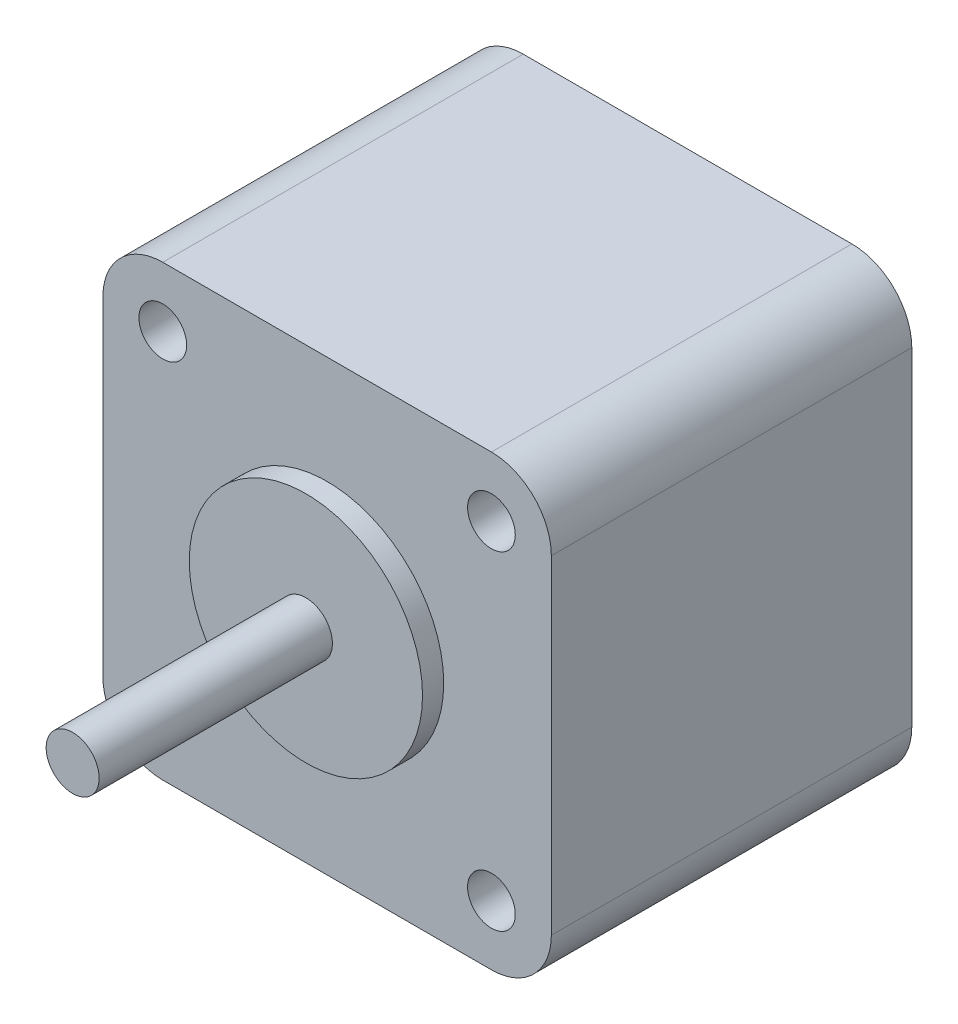
ISO-10303-21;
HEADER;
FILE_DESCRIPTION(('STEP AP214'),'2;1');
FILE_NAME('part.step','',(''),(''),'','','');
FILE_SCHEMA(('AUTOMOTIVE_DESIGN { 1 0 10303 214 1 1 1 1 }'));
ENDSEC;
DATA;
#1=APPLICATION_CONTEXT('core data for automotive mechanical design processes');
#2=APPLICATION_PROTOCOL_DEFINITION('international standard','automotive_design',2000,#1);
#3=PRODUCT_CONTEXT('',#1,'mechanical');
#4=PRODUCT('Part','Part','',(#3));
#5=PRODUCT_RELATED_PRODUCT_CATEGORY('part','',(#4));
#6=PRODUCT_DEFINITION_FORMATION('','',#4);
#7=PRODUCT_DEFINITION_CONTEXT('part definition',#1,'design');
#8=PRODUCT_DEFINITION('design','',#6,#7);
#9=PRODUCT_DEFINITION_SHAPE('','',#8);
#10=(LENGTH_UNIT() NAMED_UNIT(*) SI_UNIT(.MILLI.,.METRE.));
#11=(NAMED_UNIT(*) PLANE_ANGLE_UNIT() SI_UNIT($,.RADIAN.));
#12=(NAMED_UNIT(*) SI_UNIT($,.STERADIAN.) SOLID_ANGLE_UNIT());
#13=UNCERTAINTY_MEASURE_WITH_UNIT(LENGTH_MEASURE(1.E-05),#10,'distance_accuracy_value','');
#14=(GEOMETRIC_REPRESENTATION_CONTEXT(3) GLOBAL_UNCERTAINTY_ASSIGNED_CONTEXT((#13)) GLOBAL_UNIT_ASSIGNED_CONTEXT((#10,
#11,#12)) REPRESENTATION_CONTEXT('',''));
#15=CARTESIAN_POINT('',(0.,0.,0.));
#16=DIRECTION('',(0.,0.,1.));
#17=DIRECTION('',(1.,0.,0.));
#18=AXIS2_PLACEMENT_3D('',#15,#16,#17);
#19=CARTESIAN_POINT('',(15.5,15.5,-34.));
#20=DIRECTION('',(0.,0.,-1.));
#21=DIRECTION('',(-1.,0.,0.));
#22=AXIS2_PLACEMENT_3D('',#19,#20,#21);
#23=PLANE('',#22);
#24=CARTESIAN_POINT('',(-15.5,-15.4999999999998,-34.));
#25=DIRECTION('',(0.,0.,1.));
#26=DIRECTION('',(1.,0.,0.));
#27=AXIS2_PLACEMENT_3D('',#24,#25,#26);
#28=CIRCLE('',#27,2.24999999999995);
#29=CARTESIAN_POINT('',(-13.2500000000001,-15.4999999999998,-34.));
#30=VERTEX_POINT('',#29);
#31=EDGE_CURVE('E257',#30,#30,#28,.T.);
#32=ORIENTED_EDGE('',*,*,#31,.T.);
#33=EDGE_LOOP('',(#32));
#34=FACE_BOUND('',#33,.T.);
#35=CARTESIAN_POINT('',(15.5,15.5,-34.));
#36=DIRECTION('',(0.,0.,1.));
#37=DIRECTION('',(1.,0.,0.));
#38=AXIS2_PLACEMENT_3D('',#35,#36,#37);
#39=CIRCLE('',#38,2.25);
#40=CARTESIAN_POINT('',(17.75,15.5,-34.));
#41=VERTEX_POINT('',#40);
#42=EDGE_CURVE('E193',#41,#41,#39,.T.);
#43=ORIENTED_EDGE('',*,*,#42,.T.);
#44=EDGE_LOOP('',(#43));
#45=FACE_BOUND('',#44,.T.);
#46=CARTESIAN_POINT('',(15.5,15.5,-34.));
#47=DIRECTION('',(0.,0.,-1.));
#48=DIRECTION('',(-1.,0.,0.));
#49=AXIS2_PLACEMENT_3D('',#46,#47,#48);
#50=CIRCLE('',#49,5.65);
#51=CARTESIAN_POINT('',(15.5,21.15,-34.));
#52=VERTEX_POINT('',#51);
#53=CARTESIAN_POINT('',(21.15,15.5,-34.));
#54=VERTEX_POINT('',#53);
#55=EDGE_CURVE('E149',#52,#54,#50,.T.);
#56=ORIENTED_EDGE('',*,*,#55,.T.);
#57=DIRECTION('',(0.,-1.,0.));
#58=VECTOR('',#57,1.);
#59=CARTESIAN_POINT('',(21.15,15.5,-34.));
#60=LINE('',#59,#58);
#61=CARTESIAN_POINT('',(21.15,-15.5,-34.));
#62=VERTEX_POINT('',#61);
#63=EDGE_CURVE('E89',#54,#62,#60,.T.);
#64=ORIENTED_EDGE('',*,*,#63,.T.);
#65=CARTESIAN_POINT('',(15.5,-15.5,-34.));
#66=DIRECTION('',(0.,0.,1.));
#67=DIRECTION('',(1.,0.,0.));
#68=AXIS2_PLACEMENT_3D('',#65,#66,#67);
#69=CIRCLE('',#68,5.65);
#70=CARTESIAN_POINT('',(15.5,-21.15,-34.));
#71=VERTEX_POINT('',#70);
#72=EDGE_CURVE('E199',#71,#62,#69,.T.);
#73=ORIENTED_EDGE('',*,*,#72,.F.);
#74=DIRECTION('',(1.,0.,0.));
#75=VECTOR('',#74,1.);
#76=CARTESIAN_POINT('',(-15.5,-21.15,-34.));
#77=LINE('',#76,#75);
#78=CARTESIAN_POINT('',(-15.5,-21.15,-34.));
#79=VERTEX_POINT('',#78);
#80=EDGE_CURVE('E202',#79,#71,#77,.T.);
#81=ORIENTED_EDGE('',*,*,#80,.F.);
#82=CARTESIAN_POINT('',(-15.5,-15.5,-34.));
#83=DIRECTION('',(0.,0.,1.));
#84=DIRECTION('',(1.,0.,0.));
#85=AXIS2_PLACEMENT_3D('',#82,#83,#84);
#86=CIRCLE('',#85,5.65);
#87=CARTESIAN_POINT('',(-21.15,-15.5,-34.));
#88=VERTEX_POINT('',#87);
#89=EDGE_CURVE('E121',#88,#79,#86,.T.);
#90=ORIENTED_EDGE('',*,*,#89,.F.);
#91=DIRECTION('',(0.,-1.,0.));
#92=VECTOR('',#91,1.);
#93=CARTESIAN_POINT('',(-21.15,15.5,-34.));
#94=LINE('',#93,#92);
#95=CARTESIAN_POINT('',(-21.15,15.5,-34.));
#96=VERTEX_POINT('',#95);
#97=EDGE_CURVE('E107',#96,#88,#94,.T.);
#98=ORIENTED_EDGE('',*,*,#97,.F.);
#99=CARTESIAN_POINT('',(-15.5,15.5,-34.));
#100=DIRECTION('',(0.,0.,1.));
#101=DIRECTION('',(1.,0.,0.));
#102=AXIS2_PLACEMENT_3D('',#99,#100,#101);
#103=CIRCLE('',#102,5.65);
#104=CARTESIAN_POINT('',(-15.5,21.15,-34.));
#105=VERTEX_POINT('',#104);
#106=EDGE_CURVE('E118',#105,#96,#103,.T.);
#107=ORIENTED_EDGE('',*,*,#106,.F.);
#108=DIRECTION('',(1.,0.,0.));
#109=VECTOR('',#108,1.);
#110=CARTESIAN_POINT('',(-15.5,21.15,-34.));
#111=LINE('',#110,#109);
#112=EDGE_CURVE('E49',#105,#52,#111,.T.);
#113=ORIENTED_EDGE('',*,*,#112,.T.);
#114=EDGE_LOOP('',(#56,#64,#73,#81,#90,#98,#107,#113));
#115=FACE_BOUND('',#114,.T.);
#116=CARTESIAN_POINT('',(15.5,-15.5,-34.));
#117=DIRECTION('',(0.,0.,-1.));
#118=DIRECTION('',(-1.,0.,0.));
#119=AXIS2_PLACEMENT_3D('',#116,#117,#118);
#120=CIRCLE('',#119,2.25);
#121=CARTESIAN_POINT('',(13.25,-15.5,-34.));
#122=VERTEX_POINT('',#121);
#123=EDGE_CURVE('E196',#122,#122,#120,.T.);
#124=ORIENTED_EDGE('',*,*,#123,.F.);
#125=EDGE_LOOP('',(#124));
#126=FACE_BOUND('',#125,.T.);
#127=CARTESIAN_POINT('',(-15.5,15.4999999999998,-34.));
#128=DIRECTION('',(0.,0.,-1.));
#129=DIRECTION('',(-1.,0.,0.));
#130=AXIS2_PLACEMENT_3D('',#127,#128,#129);
#131=CIRCLE('',#130,2.24999999999995);
#132=CARTESIAN_POINT('',(-17.7499999999999,15.4999999999998,-34.));
#133=VERTEX_POINT('',#132);
#134=EDGE_CURVE('E185',#133,#133,#131,.T.);
#135=ORIENTED_EDGE('',*,*,#134,.F.);
#136=EDGE_LOOP('',(#135));
#137=FACE_BOUND('',#136,.T.);
#138=ADVANCED_FACE('F32',(#34,#45,#115,#126,#137),#23,.T.);
#139=CARTESIAN_POINT('',(15.5,15.5,0.));
#140=DIRECTION('',(0.,0.,-1.));
#141=DIRECTION('',(-1.,0.,0.));
#142=AXIS2_PLACEMENT_3D('',#139,#140,#141);
#143=PLANE('',#142);
#144=CARTESIAN_POINT('',(15.5,-15.5,0.));
#145=DIRECTION('',(0.,0.,-1.));
#146=DIRECTION('',(-1.,0.,0.));
#147=AXIS2_PLACEMENT_3D('',#144,#145,#146);
#148=CIRCLE('',#147,2.25);
#149=CARTESIAN_POINT('',(13.25,-15.5,0.));
#150=VERTEX_POINT('',#149);
#151=EDGE_CURVE('E253',#150,#150,#148,.T.);
#152=ORIENTED_EDGE('',*,*,#151,.T.);
#153=EDGE_LOOP('',(#152));
#154=FACE_BOUND('',#153,.T.);
#155=CARTESIAN_POINT('',(15.5,15.5,0.));
#156=DIRECTION('',(0.,0.,1.));
#157=DIRECTION('',(1.,0.,0.));
#158=AXIS2_PLACEMENT_3D('',#155,#156,#157);
#159=CIRCLE('',#158,2.25);
#160=CARTESIAN_POINT('',(17.75,15.5,0.));
#161=VERTEX_POINT('',#160);
#162=EDGE_CURVE('E133',#161,#161,#159,.T.);
#163=ORIENTED_EDGE('',*,*,#162,.F.);
#164=EDGE_LOOP('',(#163));
#165=FACE_BOUND('',#164,.T.);
#166=CARTESIAN_POINT('',(0.,0.,0.));
#167=DIRECTION('',(0.,0.,1.));
#168=DIRECTION('',(1.,0.,0.));
#169=AXIS2_PLACEMENT_3D('',#166,#167,#168);
#170=CIRCLE('',#169,11.);
#171=CARTESIAN_POINT('',(11.,0.,0.));
#172=VERTEX_POINT('',#171);
#173=EDGE_CURVE('E161',#172,#172,#170,.T.);
#174=ORIENTED_EDGE('',*,*,#173,.F.);
#175=EDGE_LOOP('',(#174));
#176=FACE_BOUND('',#175,.T.);
#177=CARTESIAN_POINT('',(15.5,15.5,0.));
#178=DIRECTION('',(0.,0.,-1.));
#179=DIRECTION('',(-1.,0.,0.));
#180=AXIS2_PLACEMENT_3D('',#177,#178,#179);
#181=CIRCLE('',#180,5.65);
#182=CARTESIAN_POINT('',(15.5,21.15,0.));
#183=VERTEX_POINT('',#182);
#184=CARTESIAN_POINT('',(21.15,15.5,0.));
#185=VERTEX_POINT('',#184);
#186=EDGE_CURVE('E129',#183,#185,#181,.T.);
#187=ORIENTED_EDGE('',*,*,#186,.F.);
#188=DIRECTION('',(1.,0.,0.));
#189=VECTOR('',#188,1.);
#190=CARTESIAN_POINT('',(-15.5,21.15,0.));
#191=LINE('',#190,#189);
#192=CARTESIAN_POINT('',(-15.5,21.15,0.));
#193=VERTEX_POINT('',#192);
#194=EDGE_CURVE('E80',#193,#183,#191,.T.);
#195=ORIENTED_EDGE('',*,*,#194,.F.);
#196=CARTESIAN_POINT('',(-15.5,15.5,0.));
#197=DIRECTION('',(0.,0.,1.));
#198=DIRECTION('',(1.,0.,0.));
#199=AXIS2_PLACEMENT_3D('',#196,#197,#198);
#200=CIRCLE('',#199,5.65);
#201=CARTESIAN_POINT('',(-21.15,15.5,0.));
#202=VERTEX_POINT('',#201);
#203=EDGE_CURVE('E146',#193,#202,#200,.T.);
#204=ORIENTED_EDGE('',*,*,#203,.T.);
#205=DIRECTION('',(0.,-1.,0.));
#206=VECTOR('',#205,1.);
#207=CARTESIAN_POINT('',(-21.15,15.5,0.));
#208=LINE('',#207,#206);
#209=CARTESIAN_POINT('',(-21.15,-15.5,0.));
#210=VERTEX_POINT('',#209);
#211=EDGE_CURVE('E109',#202,#210,#208,.T.);
#212=ORIENTED_EDGE('',*,*,#211,.T.);
#213=CARTESIAN_POINT('',(-15.5,-15.5,0.));
#214=DIRECTION('',(0.,0.,1.));
#215=DIRECTION('',(1.,0.,0.));
#216=AXIS2_PLACEMENT_3D('',#213,#214,#215);
#217=CIRCLE('',#216,5.65);
#218=CARTESIAN_POINT('',(-15.5,-21.15,0.));
#219=VERTEX_POINT('',#218);
#220=EDGE_CURVE('E142',#210,#219,#217,.T.);
#221=ORIENTED_EDGE('',*,*,#220,.T.);
#222=DIRECTION('',(1.,0.,0.));
#223=VECTOR('',#222,1.);
#224=CARTESIAN_POINT('',(-15.5,-21.15,0.));
#225=LINE('',#224,#223);
#226=CARTESIAN_POINT('',(15.5,-21.15,0.));
#227=VERTEX_POINT('',#226);
#228=EDGE_CURVE('E139',#219,#227,#225,.T.);
#229=ORIENTED_EDGE('',*,*,#228,.T.);
#230=CARTESIAN_POINT('',(15.5,-15.5,0.));
#231=DIRECTION('',(0.,0.,1.));
#232=DIRECTION('',(1.,0.,0.));
#233=AXIS2_PLACEMENT_3D('',#230,#231,#232);
#234=CIRCLE('',#233,5.65);
#235=CARTESIAN_POINT('',(21.15,-15.5,0.));
#236=VERTEX_POINT('',#235);
#237=EDGE_CURVE('E136',#227,#236,#234,.T.);
#238=ORIENTED_EDGE('',*,*,#237,.T.);
#239=DIRECTION('',(0.,-1.,0.));
#240=VECTOR('',#239,1.);
#241=CARTESIAN_POINT('',(21.15,15.5,0.));
#242=LINE('',#241,#240);
#243=EDGE_CURVE('E132',#185,#236,#242,.T.);
#244=ORIENTED_EDGE('',*,*,#243,.F.);
#245=EDGE_LOOP('',(#187,#195,#204,#212,#221,#229,#238,#244));
#246=FACE_BOUND('',#245,.T.);
#247=CARTESIAN_POINT('',(-15.5,-15.4999999999998,0.));
#248=DIRECTION('',(0.,0.,1.));
#249=DIRECTION('',(1.,0.,0.));
#250=AXIS2_PLACEMENT_3D('',#247,#248,#249);
#251=CIRCLE('',#250,2.24999999999995);
#252=CARTESIAN_POINT('',(-13.2500000000001,-15.4999999999998,0.));
#253=VERTEX_POINT('',#252);
#254=EDGE_CURVE('E180',#253,#253,#251,.T.);
#255=ORIENTED_EDGE('',*,*,#254,.F.);
#256=EDGE_LOOP('',(#255));
#257=FACE_BOUND('',#256,.T.);
#258=CARTESIAN_POINT('',(-15.5,15.4999999999998,0.));
#259=DIRECTION('',(0.,0.,-1.));
#260=DIRECTION('',(-1.,0.,0.));
#261=AXIS2_PLACEMENT_3D('',#258,#259,#260);
#262=CIRCLE('',#261,2.24999999999995);
#263=CARTESIAN_POINT('',(-17.7499999999999,15.4999999999998,0.));
#264=VERTEX_POINT('',#263);
#265=EDGE_CURVE('E183',#264,#264,#262,.T.);
#266=ORIENTED_EDGE('',*,*,#265,.T.);
#267=EDGE_LOOP('',(#266));
#268=FACE_BOUND('',#267,.T.);
#269=ADVANCED_FACE('F170',(#154,#165,#176,#246,#257,#268),#143,.F.);
#270=CARTESIAN_POINT('',(0.,0.,24.));
#271=DIRECTION('',(0.,0.,-1.));
#272=DIRECTION('',(-1.,0.,0.));
#273=AXIS2_PLACEMENT_3D('',#270,#271,#272);
#274=CYLINDRICAL_SURFACE('',#273,2.5);
#275=CARTESIAN_POINT('',(0.,0.,2.));
#276=DIRECTION('',(0.,0.,1.));
#277=DIRECTION('',(1.,0.,0.));
#278=AXIS2_PLACEMENT_3D('',#275,#276,#277);
#279=CIRCLE('',#278,2.5);
#280=CARTESIAN_POINT('',(2.5,0.,2.));
#281=VERTEX_POINT('',#280);
#282=EDGE_CURVE('E36',#281,#281,#279,.T.);
#283=ORIENTED_EDGE('',*,*,#282,.T.);
#284=EDGE_LOOP('',(#283));
#285=FACE_BOUND('',#284,.T.);
#286=CARTESIAN_POINT('',(0.,0.,24.));
#287=DIRECTION('',(0.,0.,1.));
#288=DIRECTION('',(1.,0.,0.));
#289=AXIS2_PLACEMENT_3D('',#286,#287,#288);
#290=CIRCLE('',#289,2.5);
#291=CARTESIAN_POINT('',(2.5,0.,24.));
#292=VERTEX_POINT('',#291);
#293=EDGE_CURVE('E11',#292,#292,#290,.T.);
#294=ORIENTED_EDGE('',*,*,#293,.F.);
#295=EDGE_LOOP('',(#294));
#296=FACE_BOUND('',#295,.T.);
#297=ADVANCED_FACE('F34',(#285,#296),#274,.T.);
#298=CARTESIAN_POINT('',(0.,0.,24.));
#299=DIRECTION('',(0.,0.,1.));
#300=DIRECTION('',(1.,0.,0.));
#301=AXIS2_PLACEMENT_3D('',#298,#299,#300);
#302=PLANE('',#301);
#303=ORIENTED_EDGE('',*,*,#293,.T.);
#304=EDGE_LOOP('',(#303));
#305=FACE_BOUND('',#304,.T.);
#306=ADVANCED_FACE('F366',(#305),#302,.T.);
#307=CARTESIAN_POINT('',(0.,0.,2.));
#308=DIRECTION('',(0.,0.,-1.));
#309=DIRECTION('',(-1.,0.,0.));
#310=AXIS2_PLACEMENT_3D('',#307,#308,#309);
#311=CYLINDRICAL_SURFACE('',#310,11.);
#312=CARTESIAN_POINT('',(0.,0.,2.));
#313=DIRECTION('',(0.,0.,1.));
#314=DIRECTION('',(1.,0.,0.));
#315=AXIS2_PLACEMENT_3D('',#312,#313,#314);
#316=CIRCLE('',#315,11.);
#317=CARTESIAN_POINT('',(11.,0.,2.));
#318=VERTEX_POINT('',#317);
#319=EDGE_CURVE('E162',#318,#318,#316,.T.);
#320=ORIENTED_EDGE('',*,*,#319,.F.);
#321=EDGE_LOOP('',(#320));
#322=FACE_BOUND('',#321,.T.);
#323=ORIENTED_EDGE('',*,*,#173,.T.);
#324=EDGE_LOOP('',(#323));
#325=FACE_BOUND('',#324,.T.);
#326=ADVANCED_FACE('F168',(#322,#325),#311,.T.);
#327=CARTESIAN_POINT('',(0.,0.,2.));
#328=DIRECTION('',(0.,0.,1.));
#329=DIRECTION('',(1.,0.,0.));
#330=AXIS2_PLACEMENT_3D('',#327,#328,#329);
#331=PLANE('',#330);
#332=ORIENTED_EDGE('',*,*,#282,.F.);
#333=EDGE_LOOP('',(#332));
#334=FACE_BOUND('',#333,.T.);
#335=ORIENTED_EDGE('',*,*,#319,.T.);
#336=EDGE_LOOP('',(#335));
#337=FACE_BOUND('',#336,.T.);
#338=ADVANCED_FACE('F350',(#334,#337),#331,.T.);
#339=CARTESIAN_POINT('',(15.5,15.5,-34.));
#340=DIRECTION('',(0.,0.,1.));
#341=DIRECTION('',(1.,0.,0.));
#342=AXIS2_PLACEMENT_3D('',#339,#340,#341);
#343=CYLINDRICAL_SURFACE('',#342,5.65);
#344=ORIENTED_EDGE('',*,*,#186,.T.);
#345=DIRECTION('',(0.,0.,1.));
#346=VECTOR('',#345,1.);
#347=CARTESIAN_POINT('',(21.15,15.5,-34.));
#348=LINE('',#347,#346);
#349=EDGE_CURVE('E159',#54,#185,#348,.T.);
#350=ORIENTED_EDGE('',*,*,#349,.F.);
#351=ORIENTED_EDGE('',*,*,#55,.F.);
#352=DIRECTION('',(0.,0.,1.));
#353=VECTOR('',#352,1.);
#354=CARTESIAN_POINT('',(15.5,21.15,-34.));
#355=LINE('',#354,#353);
#356=EDGE_CURVE('E125',#52,#183,#355,.T.);
#357=ORIENTED_EDGE('',*,*,#356,.T.);
#358=EDGE_LOOP('',(#344,#350,#351,#357));
#359=FACE_BOUND('',#358,.T.);
#360=ADVANCED_FACE('F218',(#359),#343,.T.);
#361=CARTESIAN_POINT('',(21.15,15.5,-34.));
#362=DIRECTION('',(-1.,0.,0.));
#363=DIRECTION('',(0.,-1.,0.));
#364=AXIS2_PLACEMENT_3D('',#361,#362,#363);
#365=PLANE('',#364);
#366=ORIENTED_EDGE('',*,*,#243,.T.);
#367=DIRECTION('',(0.,0.,1.));
#368=VECTOR('',#367,1.);
#369=CARTESIAN_POINT('',(21.15,-15.5,-34.));
#370=LINE('',#369,#368);
#371=EDGE_CURVE('E157',#62,#236,#370,.T.);
#372=ORIENTED_EDGE('',*,*,#371,.F.);
#373=ORIENTED_EDGE('',*,*,#63,.F.);
#374=ORIENTED_EDGE('',*,*,#349,.T.);
#375=EDGE_LOOP('',(#366,#372,#373,#374));
#376=FACE_BOUND('',#375,.T.);
#377=ADVANCED_FACE('F214',(#376),#365,.F.);
#378=CARTESIAN_POINT('',(15.5,-15.5,-34.));
#379=DIRECTION('',(0.,0.,1.));
#380=DIRECTION('',(1.,0.,0.));
#381=AXIS2_PLACEMENT_3D('',#378,#379,#380);
#382=CYLINDRICAL_SURFACE('',#381,5.65);
#383=ORIENTED_EDGE('',*,*,#237,.F.);
#384=DIRECTION('',(0.,0.,1.));
#385=VECTOR('',#384,1.);
#386=CARTESIAN_POINT('',(15.5,-21.15,-34.));
#387=LINE('',#386,#385);
#388=EDGE_CURVE('E155',#71,#227,#387,.T.);
#389=ORIENTED_EDGE('',*,*,#388,.F.);
#390=ORIENTED_EDGE('',*,*,#72,.T.);
#391=ORIENTED_EDGE('',*,*,#371,.T.);
#392=EDGE_LOOP('',(#383,#389,#390,#391));
#393=FACE_BOUND('',#392,.T.);
#394=ADVANCED_FACE('F213',(#393),#382,.T.);
#395=CARTESIAN_POINT('',(-15.5,-21.15,-34.));
#396=DIRECTION('',(0.,-1.,0.));
#397=DIRECTION('',(1.,0.,0.));
#398=AXIS2_PLACEMENT_3D('',#395,#396,#397);
#399=PLANE('',#398);
#400=ORIENTED_EDGE('',*,*,#228,.F.);
#401=DIRECTION('',(0.,0.,1.));
#402=VECTOR('',#401,1.);
#403=CARTESIAN_POINT('',(-15.5,-21.15,-34.));
#404=LINE('',#403,#402);
#405=EDGE_CURVE('E153',#79,#219,#404,.T.);
#406=ORIENTED_EDGE('',*,*,#405,.F.);
#407=ORIENTED_EDGE('',*,*,#80,.T.);
#408=ORIENTED_EDGE('',*,*,#388,.T.);
#409=EDGE_LOOP('',(#400,#406,#407,#408));
#410=FACE_BOUND('',#409,.T.);
#411=ADVANCED_FACE('F210',(#410),#399,.T.);
#412=CARTESIAN_POINT('',(-15.5,-15.5,-34.));
#413=DIRECTION('',(0.,0.,1.));
#414=DIRECTION('',(1.,0.,0.));
#415=AXIS2_PLACEMENT_3D('',#412,#413,#414);
#416=CYLINDRICAL_SURFACE('',#415,5.65);
#417=ORIENTED_EDGE('',*,*,#220,.F.);
#418=DIRECTION('',(0.,0.,1.));
#419=VECTOR('',#418,1.);
#420=CARTESIAN_POINT('',(-21.15,-15.5,-34.));
#421=LINE('',#420,#419);
#422=EDGE_CURVE('E114',#88,#210,#421,.T.);
#423=ORIENTED_EDGE('',*,*,#422,.F.);
#424=ORIENTED_EDGE('',*,*,#89,.T.);
#425=ORIENTED_EDGE('',*,*,#405,.T.);
#426=EDGE_LOOP('',(#417,#423,#424,#425));
#427=FACE_BOUND('',#426,.T.);
#428=ADVANCED_FACE('F206',(#427),#416,.T.);
#429=CARTESIAN_POINT('',(-21.15,15.5,-34.));
#430=DIRECTION('',(-1.,0.,0.));
#431=DIRECTION('',(0.,-1.,0.));
#432=AXIS2_PLACEMENT_3D('',#429,#430,#431);
#433=PLANE('',#432);
#434=ORIENTED_EDGE('',*,*,#211,.F.);
#435=DIRECTION('',(0.,0.,1.));
#436=VECTOR('',#435,1.);
#437=CARTESIAN_POINT('',(-21.15,15.5,-34.));
#438=LINE('',#437,#436);
#439=EDGE_CURVE('E104',#96,#202,#438,.T.);
#440=ORIENTED_EDGE('',*,*,#439,.F.);
#441=ORIENTED_EDGE('',*,*,#97,.T.);
#442=ORIENTED_EDGE('',*,*,#422,.T.);
#443=EDGE_LOOP('',(#434,#440,#441,#442));
#444=FACE_BOUND('',#443,.T.);
#445=ADVANCED_FACE('F106',(#444),#433,.T.);
#446=CARTESIAN_POINT('',(-15.5,15.5,-34.));
#447=DIRECTION('',(0.,0.,1.));
#448=DIRECTION('',(1.,0.,0.));
#449=AXIS2_PLACEMENT_3D('',#446,#447,#448);
#450=CYLINDRICAL_SURFACE('',#449,5.65);
#451=ORIENTED_EDGE('',*,*,#203,.F.);
#452=DIRECTION('',(0.,0.,1.));
#453=VECTOR('',#452,1.);
#454=CARTESIAN_POINT('',(-15.5,21.15,-34.));
#455=LINE('',#454,#453);
#456=EDGE_CURVE('E77',#105,#193,#455,.T.);
#457=ORIENTED_EDGE('',*,*,#456,.F.);
#458=ORIENTED_EDGE('',*,*,#106,.T.);
#459=ORIENTED_EDGE('',*,*,#439,.T.);
#460=EDGE_LOOP('',(#451,#457,#458,#459));
#461=FACE_BOUND('',#460,.T.);
#462=ADVANCED_FACE('F123',(#461),#450,.T.);
#463=CARTESIAN_POINT('',(-15.5,21.15,-34.));
#464=DIRECTION('',(0.,-1.,0.));
#465=DIRECTION('',(1.,0.,0.));
#466=AXIS2_PLACEMENT_3D('',#463,#464,#465);
#467=PLANE('',#466);
#468=ORIENTED_EDGE('',*,*,#194,.T.);
#469=ORIENTED_EDGE('',*,*,#356,.F.);
#470=ORIENTED_EDGE('',*,*,#112,.F.);
#471=ORIENTED_EDGE('',*,*,#456,.T.);
#472=EDGE_LOOP('',(#468,#469,#470,#471));
#473=FACE_BOUND('',#472,.T.);
#474=ADVANCED_FACE('F219',(#473),#467,.F.);
#475=CARTESIAN_POINT('',(15.5,15.5,0.));
#476=DIRECTION('',(0.,0.,-1.));
#477=DIRECTION('',(-1.,0.,0.));
#478=AXIS2_PLACEMENT_3D('',#475,#476,#477);
#479=CYLINDRICAL_SURFACE('',#478,2.25);
#480=ORIENTED_EDGE('',*,*,#162,.T.);
#481=EDGE_LOOP('',(#480));
#482=FACE_BOUND('',#481,.T.);
#483=ORIENTED_EDGE('',*,*,#42,.F.);
#484=EDGE_LOOP('',(#483));
#485=FACE_BOUND('',#484,.T.);
#486=ADVANCED_FACE('F221',(#482,#485),#479,.F.);
#487=CARTESIAN_POINT('',(15.5,-15.5,0.));
#488=DIRECTION('',(0.,0.,-1.));
#489=DIRECTION('',(-1.,0.,0.));
#490=AXIS2_PLACEMENT_3D('',#487,#488,#489);
#491=CYLINDRICAL_SURFACE('',#490,2.25);
#492=ORIENTED_EDGE('',*,*,#151,.F.);
#493=EDGE_LOOP('',(#492));
#494=FACE_BOUND('',#493,.T.);
#495=ORIENTED_EDGE('',*,*,#123,.T.);
#496=EDGE_LOOP('',(#495));
#497=FACE_BOUND('',#496,.T.);
#498=ADVANCED_FACE('F227',(#494,#497),#491,.F.);
#499=CARTESIAN_POINT('',(-15.5,-15.4999999999998,0.));
#500=DIRECTION('',(0.,0.,-1.));
#501=DIRECTION('',(-1.,0.,0.));
#502=AXIS2_PLACEMENT_3D('',#499,#500,#501);
#503=CYLINDRICAL_SURFACE('',#502,2.24999999999995);
#504=ORIENTED_EDGE('',*,*,#254,.T.);
#505=EDGE_LOOP('',(#504));
#506=FACE_BOUND('',#505,.T.);
#507=ORIENTED_EDGE('',*,*,#31,.F.);
#508=EDGE_LOOP('',(#507));
#509=FACE_BOUND('',#508,.T.);
#510=ADVANCED_FACE('F242',(#506,#509),#503,.F.);
#511=CARTESIAN_POINT('',(-15.5,15.4999999999998,0.));
#512=DIRECTION('',(0.,0.,-1.));
#513=DIRECTION('',(-1.,0.,0.));
#514=AXIS2_PLACEMENT_3D('',#511,#512,#513);
#515=CYLINDRICAL_SURFACE('',#514,2.24999999999995);
#516=ORIENTED_EDGE('',*,*,#265,.F.);
#517=EDGE_LOOP('',(#516));
#518=FACE_BOUND('',#517,.T.);
#519=ORIENTED_EDGE('',*,*,#134,.T.);
#520=EDGE_LOOP('',(#519));
#521=FACE_BOUND('',#520,.T.);
#522=ADVANCED_FACE('F239',(#518,#521),#515,.F.);
#523=CLOSED_SHELL('',(#138,#269,#297,#306,#326,#338,#360,#377,#394,#411,#428,#445,#462,#474,
#486,#498,#510,#522));
#524=MANIFOLD_SOLID_BREP('B2',#523);
#525=ADVANCED_BREP_SHAPE_REPRESENTATION('',(#18,#524),#14);
#526=SHAPE_DEFINITION_REPRESENTATION(#9,#525);
ENDSEC;
END-ISO-10303-21;
